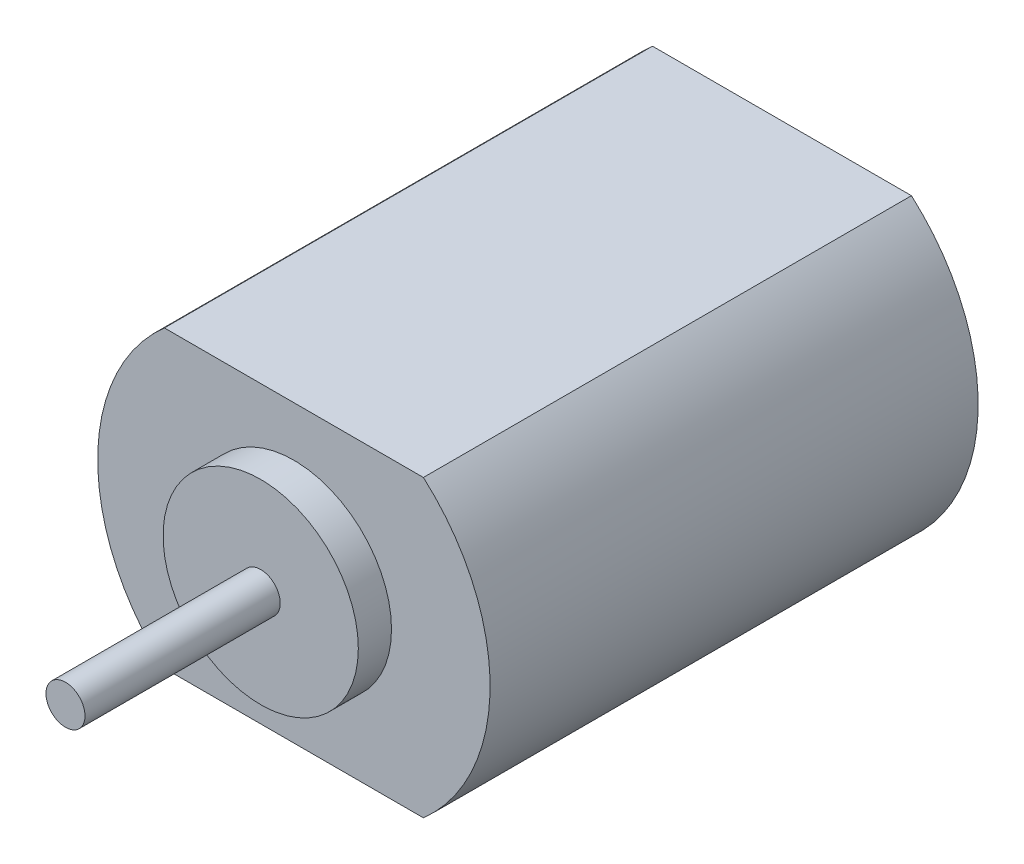
ISO-10303-21;
HEADER;
FILE_DESCRIPTION(('STEP AP214'),'2;1');
FILE_NAME('part.step','',(''),(''),'','','');
FILE_SCHEMA(('AUTOMOTIVE_DESIGN { 1 0 10303 214 1 1 1 1 }'));
ENDSEC;
DATA;
#1=APPLICATION_CONTEXT('core data for automotive mechanical design processes');
#2=APPLICATION_PROTOCOL_DEFINITION('international standard','automotive_design',2000,#1);
#3=PRODUCT_CONTEXT('',#1,'mechanical');
#4=PRODUCT('Part','Part','',(#3));
#5=PRODUCT_RELATED_PRODUCT_CATEGORY('part','',(#4));
#6=PRODUCT_DEFINITION_FORMATION('','',#4);
#7=PRODUCT_DEFINITION_CONTEXT('part definition',#1,'design');
#8=PRODUCT_DEFINITION('design','',#6,#7);
#9=PRODUCT_DEFINITION_SHAPE('','',#8);
#10=(LENGTH_UNIT() NAMED_UNIT(*) SI_UNIT(.MILLI.,.METRE.));
#11=(NAMED_UNIT(*) PLANE_ANGLE_UNIT() SI_UNIT($,.RADIAN.));
#12=(NAMED_UNIT(*) SI_UNIT($,.STERADIAN.) SOLID_ANGLE_UNIT());
#13=UNCERTAINTY_MEASURE_WITH_UNIT(LENGTH_MEASURE(1.E-05),#10,'distance_accuracy_value','');
#14=(GEOMETRIC_REPRESENTATION_CONTEXT(3) GLOBAL_UNCERTAINTY_ASSIGNED_CONTEXT((#13)) GLOBAL_UNIT_ASSIGNED_CONTEXT((#10,
#11,#12)) REPRESENTATION_CONTEXT('',''));
#15=CARTESIAN_POINT('',(0.,0.,0.));
#16=DIRECTION('',(0.,0.,1.));
#17=DIRECTION('',(1.,0.,0.));
#18=AXIS2_PLACEMENT_3D('',#15,#16,#17);
#19=CARTESIAN_POINT('',(0.,0.,26.7));
#20=DIRECTION('',(0.,0.,1.));
#21=DIRECTION('',(1.,0.,0.));
#22=AXIS2_PLACEMENT_3D('',#19,#20,#21);
#23=PLANE('',#22);
#24=CARTESIAN_POINT('',(0.,0.,26.7));
#25=DIRECTION('',(0.,0.,1.));
#26=DIRECTION('',(1.,0.,0.));
#27=AXIS2_PLACEMENT_3D('',#24,#25,#26);
#28=CIRCLE('',#27,5.);
#29=CARTESIAN_POINT('',(5.,0.,26.7));
#30=VERTEX_POINT('',#29);
#31=EDGE_CURVE('E101',#30,#30,#28,.T.);
#32=ORIENTED_EDGE('',*,*,#31,.T.);
#33=EDGE_LOOP('',(#32));
#34=FACE_BOUND('',#33,.T.);
#35=CARTESIAN_POINT('',(0.,0.,26.7));
#36=DIRECTION('',(0.,0.,1.));
#37=DIRECTION('',(1.,0.,0.));
#38=AXIS2_PLACEMENT_3D('',#35,#36,#37);
#39=CIRCLE('',#38,1.);
#40=CARTESIAN_POINT('',(1.,0.,26.7));
#41=VERTEX_POINT('',#40);
#42=EDGE_CURVE('E118',#41,#41,#39,.T.);
#43=ORIENTED_EDGE('',*,*,#42,.F.);
#44=EDGE_LOOP('',(#43));
#45=FACE_BOUND('',#44,.T.);
#46=ADVANCED_FACE('F33',(#34,#45),#23,.T.);
#47=CARTESIAN_POINT('',(0.,0.,25.));
#48=DIRECTION('',(0.,0.,1.));
#49=DIRECTION('',(1.,0.,0.));
#50=AXIS2_PLACEMENT_3D('',#47,#48,#49);
#51=PLANE('',#50);
#52=CARTESIAN_POINT('',(0.,0.,25.));
#53=DIRECTION('',(0.,0.,1.));
#54=DIRECTION('',(1.,0.,0.));
#55=AXIS2_PLACEMENT_3D('',#52,#53,#54);
#56=CIRCLE('',#55,10.05);
#57=CARTESIAN_POINT('',(6.6332495807108,-7.55,25.));
#58=VERTEX_POINT('',#57);
#59=CARTESIAN_POINT('',(6.6332495807108,7.55,25.));
#60=VERTEX_POINT('',#59);
#61=EDGE_CURVE('E86',#58,#60,#56,.T.);
#62=ORIENTED_EDGE('',*,*,#61,.T.);
#63=DIRECTION('',(-1.,0.,0.));
#64=VECTOR('',#63,1.);
#65=CARTESIAN_POINT('',(-6.6332495807108,7.55,25.));
#66=LINE('',#65,#64);
#67=CARTESIAN_POINT('',(-6.6332495807108,7.55,25.));
#68=VERTEX_POINT('',#67);
#69=EDGE_CURVE('E80',#60,#68,#66,.T.);
#70=ORIENTED_EDGE('',*,*,#69,.T.);
#71=CARTESIAN_POINT('',(0.,0.,25.));
#72=DIRECTION('',(0.,0.,1.));
#73=DIRECTION('',(1.,0.,0.));
#74=AXIS2_PLACEMENT_3D('',#71,#72,#73);
#75=CIRCLE('',#74,10.05);
#76=CARTESIAN_POINT('',(-6.6332495807108,-7.55,25.));
#77=VERTEX_POINT('',#76);
#78=EDGE_CURVE('E84',#68,#77,#75,.T.);
#79=ORIENTED_EDGE('',*,*,#78,.T.);
#80=DIRECTION('',(1.,0.,0.));
#81=VECTOR('',#80,1.);
#82=CARTESIAN_POINT('',(-6.6332495807108,-7.55,25.));
#83=LINE('',#82,#81);
#84=EDGE_CURVE('E50',#77,#58,#83,.T.);
#85=ORIENTED_EDGE('',*,*,#84,.T.);
#86=EDGE_LOOP('',(#62,#70,#79,#85));
#87=FACE_BOUND('',#86,.T.);
#88=CARTESIAN_POINT('',(0.,0.,25.));
#89=DIRECTION('',(0.,0.,1.));
#90=DIRECTION('',(1.,0.,0.));
#91=AXIS2_PLACEMENT_3D('',#88,#89,#90);
#92=CIRCLE('',#91,5.);
#93=CARTESIAN_POINT('',(5.,0.,25.));
#94=VERTEX_POINT('',#93);
#95=EDGE_CURVE('E112',#94,#94,#92,.T.);
#96=ORIENTED_EDGE('',*,*,#95,.F.);
#97=EDGE_LOOP('',(#96));
#98=FACE_BOUND('',#97,.T.);
#99=ADVANCED_FACE('F81',(#87,#98),#51,.T.);
#100=CARTESIAN_POINT('',(0.,0.,25.));
#101=DIRECTION('',(0.,0.,-1.));
#102=DIRECTION('',(-1.,0.,0.));
#103=AXIS2_PLACEMENT_3D('',#100,#101,#102);
#104=CYLINDRICAL_SURFACE('',#103,10.05);
#105=CARTESIAN_POINT('',(0.,0.,0.));
#106=DIRECTION('',(0.,0.,1.));
#107=DIRECTION('',(1.,0.,0.));
#108=AXIS2_PLACEMENT_3D('',#105,#106,#107);
#109=CIRCLE('',#108,10.05);
#110=CARTESIAN_POINT('',(6.6332495807108,-7.55,0.));
#111=VERTEX_POINT('',#110);
#112=CARTESIAN_POINT('',(6.6332495807108,7.55,0.));
#113=VERTEX_POINT('',#112);
#114=EDGE_CURVE('E98',#111,#113,#109,.T.);
#115=ORIENTED_EDGE('',*,*,#114,.T.);
#116=DIRECTION('',(0.,0.,-1.));
#117=VECTOR('',#116,1.);
#118=CARTESIAN_POINT('',(6.6332495807108,7.55,25.));
#119=LINE('',#118,#117);
#120=EDGE_CURVE('E11',#60,#113,#119,.T.);
#121=ORIENTED_EDGE('',*,*,#120,.F.);
#122=ORIENTED_EDGE('',*,*,#61,.F.);
#123=DIRECTION('',(0.,0.,-1.));
#124=VECTOR('',#123,1.);
#125=CARTESIAN_POINT('',(6.6332495807108,-7.55,25.));
#126=LINE('',#125,#124);
#127=EDGE_CURVE('E94',#58,#111,#126,.T.);
#128=ORIENTED_EDGE('',*,*,#127,.T.);
#129=EDGE_LOOP('',(#115,#121,#122,#128));
#130=FACE_BOUND('',#129,.T.);
#131=ADVANCED_FACE('F35',(#130),#104,.T.);
#132=CARTESIAN_POINT('',(-6.6332495807108,7.55,25.));
#133=DIRECTION('',(0.,-1.,0.));
#134=DIRECTION('',(0.,0.,-1.));
#135=AXIS2_PLACEMENT_3D('',#132,#133,#134);
#136=PLANE('',#135);
#137=DIRECTION('',(-1.,0.,0.));
#138=VECTOR('',#137,1.);
#139=CARTESIAN_POINT('',(-6.6332495807108,7.55,0.));
#140=LINE('',#139,#138);
#141=CARTESIAN_POINT('',(-6.6332495807108,7.55,0.));
#142=VERTEX_POINT('',#141);
#143=EDGE_CURVE('E90',#113,#142,#140,.T.);
#144=ORIENTED_EDGE('',*,*,#143,.T.);
#145=DIRECTION('',(0.,0.,-1.));
#146=VECTOR('',#145,1.);
#147=CARTESIAN_POINT('',(-6.6332495807108,7.55,25.));
#148=LINE('',#147,#146);
#149=EDGE_CURVE('E42',#68,#142,#148,.T.);
#150=ORIENTED_EDGE('',*,*,#149,.F.);
#151=ORIENTED_EDGE('',*,*,#69,.F.);
#152=ORIENTED_EDGE('',*,*,#120,.T.);
#153=EDGE_LOOP('',(#144,#150,#151,#152));
#154=FACE_BOUND('',#153,.T.);
#155=ADVANCED_FACE('F89',(#154),#136,.F.);
#156=CARTESIAN_POINT('',(0.,0.,25.));
#157=DIRECTION('',(0.,0.,-1.));
#158=DIRECTION('',(-1.,0.,0.));
#159=AXIS2_PLACEMENT_3D('',#156,#157,#158);
#160=CYLINDRICAL_SURFACE('',#159,10.05);
#161=CARTESIAN_POINT('',(0.,0.,0.));
#162=DIRECTION('',(0.,0.,1.));
#163=DIRECTION('',(1.,0.,0.));
#164=AXIS2_PLACEMENT_3D('',#161,#162,#163);
#165=CIRCLE('',#164,10.05);
#166=CARTESIAN_POINT('',(-6.6332495807108,-7.55,0.));
#167=VERTEX_POINT('',#166);
#168=EDGE_CURVE('E67',#142,#167,#165,.T.);
#169=ORIENTED_EDGE('',*,*,#168,.T.);
#170=DIRECTION('',(0.,0.,-1.));
#171=VECTOR('',#170,1.);
#172=CARTESIAN_POINT('',(-6.6332495807108,-7.55,25.));
#173=LINE('',#172,#171);
#174=EDGE_CURVE('E91',#77,#167,#173,.T.);
#175=ORIENTED_EDGE('',*,*,#174,.F.);
#176=ORIENTED_EDGE('',*,*,#78,.F.);
#177=ORIENTED_EDGE('',*,*,#149,.T.);
#178=EDGE_LOOP('',(#169,#175,#176,#177));
#179=FACE_BOUND('',#178,.T.);
#180=ADVANCED_FACE('F92',(#179),#160,.T.);
#181=CARTESIAN_POINT('',(-6.6332495807108,-7.55,25.));
#182=DIRECTION('',(0.,1.,0.));
#183=DIRECTION('',(0.,0.,1.));
#184=AXIS2_PLACEMENT_3D('',#181,#182,#183);
#185=PLANE('',#184);
#186=DIRECTION('',(1.,0.,0.));
#187=VECTOR('',#186,1.);
#188=CARTESIAN_POINT('',(-6.6332495807108,-7.55,0.));
#189=LINE('',#188,#187);
#190=EDGE_CURVE('E73',#167,#111,#189,.T.);
#191=ORIENTED_EDGE('',*,*,#190,.T.);
#192=ORIENTED_EDGE('',*,*,#127,.F.);
#193=ORIENTED_EDGE('',*,*,#84,.F.);
#194=ORIENTED_EDGE('',*,*,#174,.T.);
#195=EDGE_LOOP('',(#191,#192,#193,#194));
#196=FACE_BOUND('',#195,.T.);
#197=ADVANCED_FACE('F106',(#196),#185,.F.);
#198=CARTESIAN_POINT('',(0.,0.,0.));
#199=DIRECTION('',(0.,0.,1.));
#200=DIRECTION('',(1.,0.,0.));
#201=AXIS2_PLACEMENT_3D('',#198,#199,#200);
#202=PLANE('',#201);
#203=ORIENTED_EDGE('',*,*,#114,.F.);
#204=ORIENTED_EDGE('',*,*,#190,.F.);
#205=ORIENTED_EDGE('',*,*,#168,.F.);
#206=ORIENTED_EDGE('',*,*,#143,.F.);
#207=EDGE_LOOP('',(#203,#204,#205,#206));
#208=FACE_BOUND('',#207,.T.);
#209=ADVANCED_FACE('F109',(#208),#202,.F.);
#210=CARTESIAN_POINT('',(0.,0.,26.7));
#211=DIRECTION('',(0.,0.,-1.));
#212=DIRECTION('',(-1.,0.,0.));
#213=AXIS2_PLACEMENT_3D('',#210,#211,#212);
#214=CYLINDRICAL_SURFACE('',#213,5.);
#215=ORIENTED_EDGE('',*,*,#31,.F.);
#216=EDGE_LOOP('',(#215));
#217=FACE_BOUND('',#216,.T.);
#218=ORIENTED_EDGE('',*,*,#95,.T.);
#219=EDGE_LOOP('',(#218));
#220=FACE_BOUND('',#219,.T.);
#221=ADVANCED_FACE('F129',(#217,#220),#214,.T.);
#222=CARTESIAN_POINT('',(0.,0.,36.7));
#223=DIRECTION('',(0.,0.,-1.));
#224=DIRECTION('',(-1.,0.,0.));
#225=AXIS2_PLACEMENT_3D('',#222,#223,#224);
#226=CYLINDRICAL_SURFACE('',#225,1.);
#227=CARTESIAN_POINT('',(0.,0.,36.7));
#228=DIRECTION('',(0.,0.,1.));
#229=DIRECTION('',(1.,0.,0.));
#230=AXIS2_PLACEMENT_3D('',#227,#228,#229);
#231=CIRCLE('',#230,1.);
#232=CARTESIAN_POINT('',(1.,0.,36.7));
#233=VERTEX_POINT('',#232);
#234=EDGE_CURVE('E115',#233,#233,#231,.T.);
#235=ORIENTED_EDGE('',*,*,#234,.F.);
#236=EDGE_LOOP('',(#235));
#237=FACE_BOUND('',#236,.T.);
#238=ORIENTED_EDGE('',*,*,#42,.T.);
#239=EDGE_LOOP('',(#238));
#240=FACE_BOUND('',#239,.T.);
#241=ADVANCED_FACE('F126',(#237,#240),#226,.T.);
#242=CARTESIAN_POINT('',(0.,0.,36.7));
#243=DIRECTION('',(0.,0.,1.));
#244=DIRECTION('',(1.,0.,0.));
#245=AXIS2_PLACEMENT_3D('',#242,#243,#244);
#246=PLANE('',#245);
#247=ORIENTED_EDGE('',*,*,#234,.T.);
#248=EDGE_LOOP('',(#247));
#249=FACE_BOUND('',#248,.T.);
#250=ADVANCED_FACE('F124',(#249),#246,.T.);
#251=CLOSED_SHELL('',(#46,#99,#131,#155,#180,#197,#209,#221,#241,#250));
#252=MANIFOLD_SOLID_BREP('B2',#251);
#253=ADVANCED_BREP_SHAPE_REPRESENTATION('',(#18,#252),#14);
#254=SHAPE_DEFINITION_REPRESENTATION(#9,#253);
ENDSEC;
END-ISO-10303-21;
